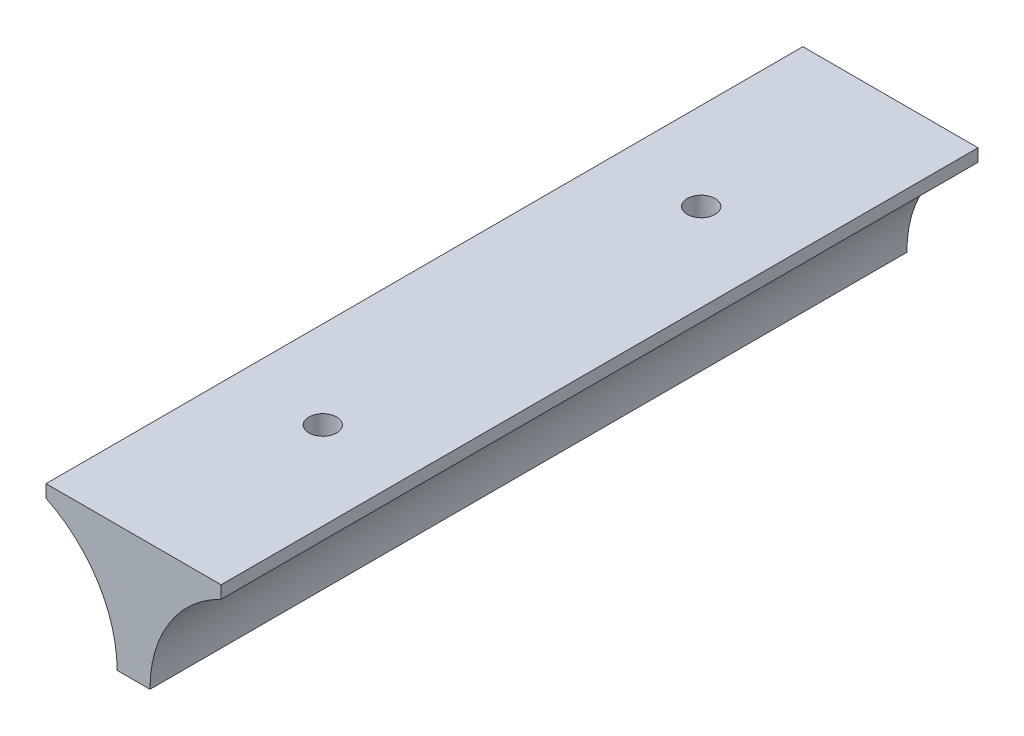
ISO-10303-21;
HEADER;
FILE_DESCRIPTION(('STEP AP214'),'2;1');
FILE_NAME('part.step','',(''),(''),'','','');
FILE_SCHEMA(('AUTOMOTIVE_DESIGN { 1 0 10303 214 1 1 1 1 }'));
ENDSEC;
DATA;
#1=APPLICATION_CONTEXT('core data for automotive mechanical design processes');
#2=APPLICATION_PROTOCOL_DEFINITION('international standard','automotive_design',2000,#1);
#3=PRODUCT_CONTEXT('',#1,'mechanical');
#4=PRODUCT('Part','Part','',(#3));
#5=PRODUCT_RELATED_PRODUCT_CATEGORY('part','',(#4));
#6=PRODUCT_DEFINITION_FORMATION('','',#4);
#7=PRODUCT_DEFINITION_CONTEXT('part definition',#1,'design');
#8=PRODUCT_DEFINITION('design','',#6,#7);
#9=PRODUCT_DEFINITION_SHAPE('','',#8);
#10=(LENGTH_UNIT() NAMED_UNIT(*) SI_UNIT(.MILLI.,.METRE.));
#11=(NAMED_UNIT(*) PLANE_ANGLE_UNIT() SI_UNIT($,.RADIAN.));
#12=(NAMED_UNIT(*) SI_UNIT($,.STERADIAN.) SOLID_ANGLE_UNIT());
#13=UNCERTAINTY_MEASURE_WITH_UNIT(LENGTH_MEASURE(1.E-05),#10,'distance_accuracy_value','');
#14=(GEOMETRIC_REPRESENTATION_CONTEXT(3) GLOBAL_UNCERTAINTY_ASSIGNED_CONTEXT((#13)) GLOBAL_UNIT_ASSIGNED_CONTEXT((#10,
#11,#12)) REPRESENTATION_CONTEXT('',''));
#15=CARTESIAN_POINT('',(0.,0.,0.));
#16=DIRECTION('',(0.,0.,1.));
#17=DIRECTION('',(1.,0.,0.));
#18=AXIS2_PLACEMENT_3D('',#15,#16,#17);
#19=CARTESIAN_POINT('',(6.94110105645933,10.,30.));
#20=DIRECTION('',(0.,-1.,0.));
#21=DIRECTION('',(0.,0.,-1.));
#22=AXIS2_PLACEMENT_3D('',#19,#20,#21);
#23=PLANE('',#22);
#24=CARTESIAN_POINT('',(0.,10.,15.));
#25=DIRECTION('',(0.,1.,0.));
#26=DIRECTION('',(0.,0.,1.));
#27=AXIS2_PLACEMENT_3D('',#24,#25,#26);
#28=CIRCLE('',#27,1.1);
#29=CARTESIAN_POINT('',(0.,10.,16.1));
#30=VERTEX_POINT('',#29);
#31=EDGE_CURVE('E186',#30,#30,#28,.T.);
#32=ORIENTED_EDGE('',*,*,#31,.F.);
#33=EDGE_LOOP('',(#32));
#34=FACE_BOUND('',#33,.T.);
#35=DIRECTION('',(-1.,0.,0.));
#36=VECTOR('',#35,1.);
#37=CARTESIAN_POINT('',(6.94110105645933,10.,-30.));
#38=LINE('',#37,#36);
#39=CARTESIAN_POINT('',(6.94110105645933,10.,-30.));
#40=VERTEX_POINT('',#39);
#41=CARTESIAN_POINT('',(-6.94110105645933,10.,-30.));
#42=VERTEX_POINT('',#41);
#43=EDGE_CURVE('E78',#40,#42,#38,.T.);
#44=ORIENTED_EDGE('',*,*,#43,.T.);
#45=DIRECTION('',(0.,0.,-1.));
#46=VECTOR('',#45,1.);
#47=CARTESIAN_POINT('',(-6.94110105645933,10.,30.));
#48=LINE('',#47,#46);
#49=CARTESIAN_POINT('',(-6.94110105645933,10.,30.));
#50=VERTEX_POINT('',#49);
#51=EDGE_CURVE('E115',#50,#42,#48,.T.);
#52=ORIENTED_EDGE('',*,*,#51,.F.);
#53=DIRECTION('',(-1.,0.,0.));
#54=VECTOR('',#53,1.);
#55=CARTESIAN_POINT('',(6.94110105645933,10.,30.));
#56=LINE('',#55,#54);
#57=CARTESIAN_POINT('',(6.94110105645933,10.,30.));
#58=VERTEX_POINT('',#57);
#59=EDGE_CURVE('E103',#58,#50,#56,.T.);
#60=ORIENTED_EDGE('',*,*,#59,.F.);
#61=DIRECTION('',(0.,0.,-1.));
#62=VECTOR('',#61,1.);
#63=CARTESIAN_POINT('',(6.94110105645933,10.,30.));
#64=LINE('',#63,#62);
#65=EDGE_CURVE('E110',#58,#40,#64,.T.);
#66=ORIENTED_EDGE('',*,*,#65,.T.);
#67=EDGE_LOOP('',(#44,#52,#60,#66));
#68=FACE_BOUND('',#67,.T.);
#69=CARTESIAN_POINT('',(0.,10.,-15.));
#70=DIRECTION('',(0.,1.,0.));
#71=DIRECTION('',(0.,0.,1.));
#72=AXIS2_PLACEMENT_3D('',#69,#70,#71);
#73=CIRCLE('',#72,1.1);
#74=CARTESIAN_POINT('',(0.,10.,-13.9));
#75=VERTEX_POINT('',#74);
#76=EDGE_CURVE('E178',#75,#75,#73,.T.);
#77=ORIENTED_EDGE('',*,*,#76,.F.);
#78=EDGE_LOOP('',(#77));
#79=FACE_BOUND('',#78,.T.);
#80=ADVANCED_FACE('F38',(#34,#68,#79),#23,.F.);
#81=CARTESIAN_POINT('',(-11.3,0.,30.));
#82=DIRECTION('',(0.,0.,-1.));
#83=DIRECTION('',(-1.,0.,0.));
#84=AXIS2_PLACEMENT_3D('',#81,#82,#83);
#85=CYLINDRICAL_SURFACE('',#84,10.);
#86=CARTESIAN_POINT('',(-11.3,0.,-30.));
#87=DIRECTION('',(0.,0.,-1.));
#88=DIRECTION('',(1.,0.,0.));
#89=AXIS2_PLACEMENT_3D('',#86,#87,#88);
#90=CIRCLE('',#89,10.);
#91=CARTESIAN_POINT('',(-6.94110105645933,9.,-30.));
#92=VERTEX_POINT('',#91);
#93=CARTESIAN_POINT('',(-1.3,0.,-30.));
#94=VERTEX_POINT('',#93);
#95=EDGE_CURVE('E123',#92,#94,#90,.T.);
#96=ORIENTED_EDGE('',*,*,#95,.T.);
#97=DIRECTION('',(0.,0.,-1.));
#98=VECTOR('',#97,1.);
#99=CARTESIAN_POINT('',(-1.3,0.,30.));
#100=LINE('',#99,#98);
#101=CARTESIAN_POINT('',(-1.3,0.,30.));
#102=VERTEX_POINT('',#101);
#103=EDGE_CURVE('E11',#102,#94,#100,.T.);
#104=ORIENTED_EDGE('',*,*,#103,.F.);
#105=CARTESIAN_POINT('',(-11.3,0.,30.));
#106=DIRECTION('',(0.,0.,-1.));
#107=DIRECTION('',(1.,0.,0.));
#108=AXIS2_PLACEMENT_3D('',#105,#106,#107);
#109=CIRCLE('',#108,10.);
#110=CARTESIAN_POINT('',(-6.94110105645933,9.,30.));
#111=VERTEX_POINT('',#110);
#112=EDGE_CURVE('E134',#111,#102,#109,.T.);
#113=ORIENTED_EDGE('',*,*,#112,.F.);
#114=DIRECTION('',(0.,0.,-1.));
#115=VECTOR('',#114,1.);
#116=CARTESIAN_POINT('',(-6.94110105645933,9.,30.));
#117=LINE('',#116,#115);
#118=EDGE_CURVE('E119',#111,#92,#117,.T.);
#119=ORIENTED_EDGE('',*,*,#118,.T.);
#120=EDGE_LOOP('',(#96,#104,#113,#119));
#121=FACE_BOUND('',#120,.T.);
#122=ADVANCED_FACE('F40',(#121),#85,.F.);
#123=CARTESIAN_POINT('',(-1.3,0.,30.));
#124=DIRECTION('',(0.,1.,0.));
#125=DIRECTION('',(-1.,0.,0.));
#126=AXIS2_PLACEMENT_3D('',#123,#124,#125);
#127=PLANE('',#126);
#128=CARTESIAN_POINT('',(0.,0.,15.));
#129=DIRECTION('',(0.,1.,0.));
#130=DIRECTION('',(-1.,0.,0.));
#131=AXIS2_PLACEMENT_3D('',#128,#129,#130);
#132=CIRCLE('',#131,1.1);
#133=CARTESIAN_POINT('',(-1.1,0.,15.));
#134=VERTEX_POINT('',#133);
#135=EDGE_CURVE('E174',#134,#134,#132,.T.);
#136=ORIENTED_EDGE('',*,*,#135,.T.);
#137=EDGE_LOOP('',(#136));
#138=FACE_BOUND('',#137,.T.);
#139=CARTESIAN_POINT('',(0.,0.,-15.));
#140=DIRECTION('',(0.,1.,0.));
#141=DIRECTION('',(-1.,0.,0.));
#142=AXIS2_PLACEMENT_3D('',#139,#140,#141);
#143=CIRCLE('',#142,1.1);
#144=CARTESIAN_POINT('',(-1.1,0.,-15.));
#145=VERTEX_POINT('',#144);
#146=EDGE_CURVE('E127',#145,#145,#143,.T.);
#147=ORIENTED_EDGE('',*,*,#146,.T.);
#148=EDGE_LOOP('',(#147));
#149=FACE_BOUND('',#148,.T.);
#150=DIRECTION('',(1.,0.,0.));
#151=VECTOR('',#150,1.);
#152=CARTESIAN_POINT('',(-1.3,0.,-30.));
#153=LINE('',#152,#151);
#154=CARTESIAN_POINT('',(1.3,0.,-30.));
#155=VERTEX_POINT('',#154);
#156=EDGE_CURVE('E126',#94,#155,#153,.T.);
#157=ORIENTED_EDGE('',*,*,#156,.T.);
#158=DIRECTION('',(0.,0.,-1.));
#159=VECTOR('',#158,1.);
#160=CARTESIAN_POINT('',(1.3,0.,30.));
#161=LINE('',#160,#159);
#162=CARTESIAN_POINT('',(1.3,0.,30.));
#163=VERTEX_POINT('',#162);
#164=EDGE_CURVE('E47',#163,#155,#161,.T.);
#165=ORIENTED_EDGE('',*,*,#164,.F.);
#166=DIRECTION('',(1.,0.,0.));
#167=VECTOR('',#166,1.);
#168=CARTESIAN_POINT('',(-1.3,0.,30.));
#169=LINE('',#168,#167);
#170=EDGE_CURVE('E92',#102,#163,#169,.T.);
#171=ORIENTED_EDGE('',*,*,#170,.F.);
#172=ORIENTED_EDGE('',*,*,#103,.T.);
#173=EDGE_LOOP('',(#157,#165,#171,#172));
#174=FACE_BOUND('',#173,.T.);
#175=ADVANCED_FACE('F163',(#138,#149,#174),#127,.F.);
#176=CARTESIAN_POINT('',(11.3,0.,30.));
#177=DIRECTION('',(0.,0.,-1.));
#178=DIRECTION('',(-1.,0.,0.));
#179=AXIS2_PLACEMENT_3D('',#176,#177,#178);
#180=CYLINDRICAL_SURFACE('',#179,10.);
#181=CARTESIAN_POINT('',(11.3,0.,-30.));
#182=DIRECTION('',(0.,0.,-1.));
#183=DIRECTION('',(-1.,0.,0.));
#184=AXIS2_PLACEMENT_3D('',#181,#182,#183);
#185=CIRCLE('',#184,10.);
#186=CARTESIAN_POINT('',(6.94110105645933,9.,-30.));
#187=VERTEX_POINT('',#186);
#188=EDGE_CURVE('E129',#155,#187,#185,.T.);
#189=ORIENTED_EDGE('',*,*,#188,.T.);
#190=DIRECTION('',(0.,0.,-1.));
#191=VECTOR('',#190,1.);
#192=CARTESIAN_POINT('',(6.94110105645933,9.,30.));
#193=LINE('',#192,#191);
#194=CARTESIAN_POINT('',(6.94110105645933,9.,30.));
#195=VERTEX_POINT('',#194);
#196=EDGE_CURVE('E114',#195,#187,#193,.T.);
#197=ORIENTED_EDGE('',*,*,#196,.F.);
#198=CARTESIAN_POINT('',(11.3,0.,30.));
#199=DIRECTION('',(0.,0.,-1.));
#200=DIRECTION('',(-1.,0.,0.));
#201=AXIS2_PLACEMENT_3D('',#198,#199,#200);
#202=CIRCLE('',#201,10.);
#203=EDGE_CURVE('E105',#163,#195,#202,.T.);
#204=ORIENTED_EDGE('',*,*,#203,.F.);
#205=ORIENTED_EDGE('',*,*,#164,.T.);
#206=EDGE_LOOP('',(#189,#197,#204,#205));
#207=FACE_BOUND('',#206,.T.);
#208=ADVANCED_FACE('F140',(#207),#180,.F.);
#209=CARTESIAN_POINT('',(6.94110105645933,9.,30.));
#210=DIRECTION('',(-1.,0.,0.));
#211=DIRECTION('',(0.,0.,1.));
#212=AXIS2_PLACEMENT_3D('',#209,#210,#211);
#213=PLANE('',#212);
#214=DIRECTION('',(0.,1.,0.));
#215=VECTOR('',#214,1.);
#216=CARTESIAN_POINT('',(6.94110105645933,9.,-30.));
#217=LINE('',#216,#215);
#218=EDGE_CURVE('E113',#187,#40,#217,.T.);
#219=ORIENTED_EDGE('',*,*,#218,.T.);
#220=ORIENTED_EDGE('',*,*,#65,.F.);
#221=DIRECTION('',(0.,1.,0.));
#222=VECTOR('',#221,1.);
#223=CARTESIAN_POINT('',(6.94110105645933,9.,30.));
#224=LINE('',#223,#222);
#225=EDGE_CURVE('E99',#195,#58,#224,.T.);
#226=ORIENTED_EDGE('',*,*,#225,.F.);
#227=ORIENTED_EDGE('',*,*,#196,.T.);
#228=EDGE_LOOP('',(#219,#220,#226,#227));
#229=FACE_BOUND('',#228,.T.);
#230=ADVANCED_FACE('F111',(#229),#213,.F.);
#231=CARTESIAN_POINT('',(-6.94110105645933,10.,30.));
#232=DIRECTION('',(1.,0.,0.));
#233=DIRECTION('',(0.,0.,-1.));
#234=AXIS2_PLACEMENT_3D('',#231,#232,#233);
#235=PLANE('',#234);
#236=DIRECTION('',(0.,-1.,0.));
#237=VECTOR('',#236,1.);
#238=CARTESIAN_POINT('',(-6.94110105645933,10.,-30.));
#239=LINE('',#238,#237);
#240=EDGE_CURVE('E84',#42,#92,#239,.T.);
#241=ORIENTED_EDGE('',*,*,#240,.T.);
#242=ORIENTED_EDGE('',*,*,#118,.F.);
#243=DIRECTION('',(0.,-1.,0.));
#244=VECTOR('',#243,1.);
#245=CARTESIAN_POINT('',(-6.94110105645933,10.,30.));
#246=LINE('',#245,#244);
#247=EDGE_CURVE('E55',#50,#111,#246,.T.);
#248=ORIENTED_EDGE('',*,*,#247,.F.);
#249=ORIENTED_EDGE('',*,*,#51,.T.);
#250=EDGE_LOOP('',(#241,#242,#248,#249));
#251=FACE_BOUND('',#250,.T.);
#252=ADVANCED_FACE('F147',(#251),#235,.F.);
#253=CARTESIAN_POINT('',(-11.3,0.,30.));
#254=DIRECTION('',(0.,0.,1.));
#255=DIRECTION('',(1.,0.,0.));
#256=AXIS2_PLACEMENT_3D('',#253,#254,#255);
#257=PLANE('',#256);
#258=ORIENTED_EDGE('',*,*,#112,.T.);
#259=ORIENTED_EDGE('',*,*,#170,.T.);
#260=ORIENTED_EDGE('',*,*,#203,.T.);
#261=ORIENTED_EDGE('',*,*,#225,.T.);
#262=ORIENTED_EDGE('',*,*,#59,.T.);
#263=ORIENTED_EDGE('',*,*,#247,.T.);
#264=EDGE_LOOP('',(#258,#259,#260,#261,#262,#263));
#265=FACE_BOUND('',#264,.T.);
#266=ADVANCED_FACE('F101',(#265),#257,.T.);
#267=CARTESIAN_POINT('',(-11.3,0.,-30.));
#268=DIRECTION('',(0.,0.,1.));
#269=DIRECTION('',(1.,0.,0.));
#270=AXIS2_PLACEMENT_3D('',#267,#268,#269);
#271=PLANE('',#270);
#272=ORIENTED_EDGE('',*,*,#95,.F.);
#273=ORIENTED_EDGE('',*,*,#240,.F.);
#274=ORIENTED_EDGE('',*,*,#43,.F.);
#275=ORIENTED_EDGE('',*,*,#218,.F.);
#276=ORIENTED_EDGE('',*,*,#188,.F.);
#277=ORIENTED_EDGE('',*,*,#156,.F.);
#278=EDGE_LOOP('',(#272,#273,#274,#275,#276,#277));
#279=FACE_BOUND('',#278,.T.);
#280=ADVANCED_FACE('F143',(#279),#271,.F.);
#281=CARTESIAN_POINT('',(0.,10.,-15.));
#282=DIRECTION('',(0.,1.,0.));
#283=DIRECTION('',(0.,0.,1.));
#284=AXIS2_PLACEMENT_3D('',#281,#282,#283);
#285=CYLINDRICAL_SURFACE('',#284,1.1);
#286=ORIENTED_EDGE('',*,*,#146,.F.);
#287=EDGE_LOOP('',(#286));
#288=FACE_BOUND('',#287,.T.);
#289=ORIENTED_EDGE('',*,*,#76,.T.);
#290=EDGE_LOOP('',(#289));
#291=FACE_BOUND('',#290,.T.);
#292=ADVANCED_FACE('F191',(#288,#291),#285,.F.);
#293=CARTESIAN_POINT('',(0.,10.,15.));
#294=DIRECTION('',(0.,1.,0.));
#295=DIRECTION('',(0.,0.,1.));
#296=AXIS2_PLACEMENT_3D('',#293,#294,#295);
#297=CYLINDRICAL_SURFACE('',#296,1.1);
#298=ORIENTED_EDGE('',*,*,#135,.F.);
#299=EDGE_LOOP('',(#298));
#300=FACE_BOUND('',#299,.T.);
#301=ORIENTED_EDGE('',*,*,#31,.T.);
#302=EDGE_LOOP('',(#301));
#303=FACE_BOUND('',#302,.T.);
#304=ADVANCED_FACE('F189',(#300,#303),#297,.F.);
#305=CLOSED_SHELL('',(#80,#122,#175,#208,#230,#252,#266,#280,#292,#304));
#306=MANIFOLD_SOLID_BREP('B2',#305);
#307=ADVANCED_BREP_SHAPE_REPRESENTATION('',(#18,#306),#14);
#308=SHAPE_DEFINITION_REPRESENTATION(#9,#307);
ENDSEC;
END-ISO-10303-21;
